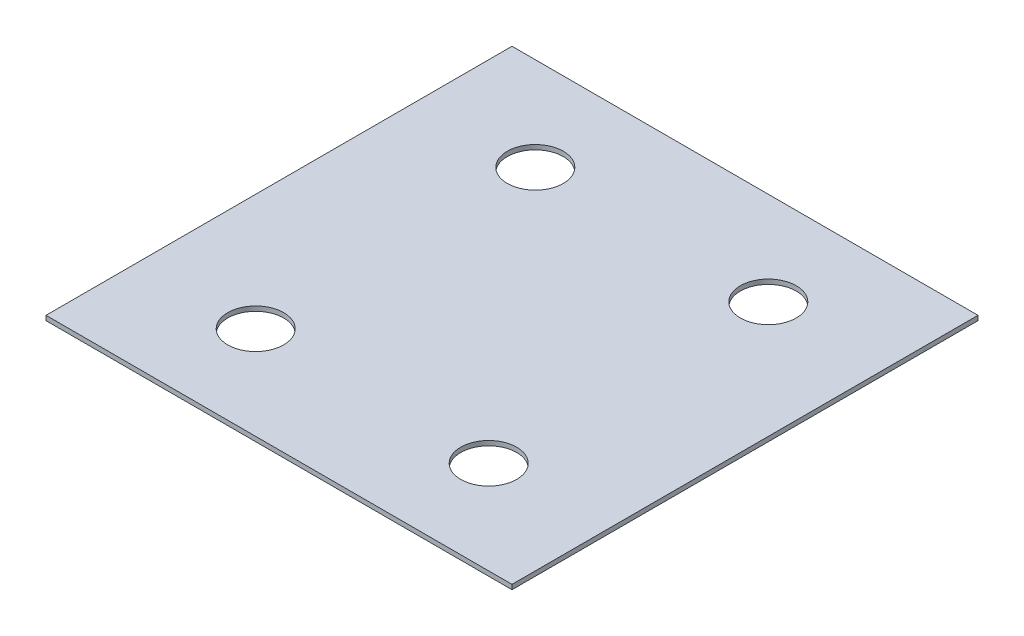
ISO-10303-21;
HEADER;
FILE_DESCRIPTION(('STEP AP214'),'2;1');
FILE_NAME('part.step','',(''),(''),'','','');
FILE_SCHEMA(('AUTOMOTIVE_DESIGN { 1 0 10303 214 1 1 1 1 }'));
ENDSEC;
DATA;
#1=APPLICATION_CONTEXT('core data for automotive mechanical design processes');
#2=APPLICATION_PROTOCOL_DEFINITION('international standard','automotive_design',2000,#1);
#3=PRODUCT_CONTEXT('',#1,'mechanical');
#4=PRODUCT('Part','Part','',(#3));
#5=PRODUCT_RELATED_PRODUCT_CATEGORY('part','',(#4));
#6=PRODUCT_DEFINITION_FORMATION('','',#4);
#7=PRODUCT_DEFINITION_CONTEXT('part definition',#1,'design');
#8=PRODUCT_DEFINITION('design','',#6,#7);
#9=PRODUCT_DEFINITION_SHAPE('','',#8);
#10=(LENGTH_UNIT() NAMED_UNIT(*) SI_UNIT(.MILLI.,.METRE.));
#11=(NAMED_UNIT(*) PLANE_ANGLE_UNIT() SI_UNIT($,.RADIAN.));
#12=(NAMED_UNIT(*) SI_UNIT($,.STERADIAN.) SOLID_ANGLE_UNIT());
#13=UNCERTAINTY_MEASURE_WITH_UNIT(LENGTH_MEASURE(1.E-05),#10,'distance_accuracy_value','');
#14=(GEOMETRIC_REPRESENTATION_CONTEXT(3) GLOBAL_UNCERTAINTY_ASSIGNED_CONTEXT((#13)) GLOBAL_UNIT_ASSIGNED_CONTEXT((#10,
#11,#12)) REPRESENTATION_CONTEXT('',''));
#15=CARTESIAN_POINT('',(0.,0.,0.));
#16=DIRECTION('',(0.,0.,1.));
#17=DIRECTION('',(1.,0.,0.));
#18=AXIS2_PLACEMENT_3D('',#15,#16,#17);
#19=CARTESIAN_POINT('',(250.,5.,250.));
#20=DIRECTION('',(-1.,0.,0.));
#21=DIRECTION('',(0.,0.,1.));
#22=AXIS2_PLACEMENT_3D('',#19,#20,#21);
#23=PLANE('',#22);
#24=DIRECTION('',(0.,0.,-1.));
#25=VECTOR('',#24,1.);
#26=CARTESIAN_POINT('',(250.,0.,250.));
#27=LINE('',#26,#25);
#28=CARTESIAN_POINT('',(250.,0.,250.));
#29=VERTEX_POINT('',#28);
#30=CARTESIAN_POINT('',(250.,0.,-250.));
#31=VERTEX_POINT('',#30);
#32=EDGE_CURVE('E96',#29,#31,#27,.T.);
#33=ORIENTED_EDGE('',*,*,#32,.T.);
#34=DIRECTION('',(0.,-1.,0.));
#35=VECTOR('',#34,1.);
#36=CARTESIAN_POINT('',(250.,5.,-250.));
#37=LINE('',#36,#35);
#38=CARTESIAN_POINT('',(250.,5.,-250.));
#39=VERTEX_POINT('',#38);
#40=EDGE_CURVE('E11',#39,#31,#37,.T.);
#41=ORIENTED_EDGE('',*,*,#40,.F.);
#42=DIRECTION('',(0.,0.,-1.));
#43=VECTOR('',#42,1.);
#44=CARTESIAN_POINT('',(250.,5.,250.));
#45=LINE('',#44,#43);
#46=CARTESIAN_POINT('',(250.,5.,250.));
#47=VERTEX_POINT('',#46);
#48=EDGE_CURVE('E84',#47,#39,#45,.T.);
#49=ORIENTED_EDGE('',*,*,#48,.F.);
#50=DIRECTION('',(0.,-1.,0.));
#51=VECTOR('',#50,1.);
#52=CARTESIAN_POINT('',(250.,5.,250.));
#53=LINE('',#52,#51);
#54=EDGE_CURVE('E92',#47,#29,#53,.T.);
#55=ORIENTED_EDGE('',*,*,#54,.T.);
#56=EDGE_LOOP('',(#33,#41,#49,#55));
#57=FACE_BOUND('',#56,.T.);
#58=ADVANCED_FACE('F33',(#57),#23,.F.);
#59=CARTESIAN_POINT('',(-250.,5.,-250.));
#60=DIRECTION('',(0.,0.,1.));
#61=DIRECTION('',(1.,0.,0.));
#62=AXIS2_PLACEMENT_3D('',#59,#60,#61);
#63=PLANE('',#62);
#64=DIRECTION('',(-1.,0.,0.));
#65=VECTOR('',#64,1.);
#66=CARTESIAN_POINT('',(-250.,0.,-250.));
#67=LINE('',#66,#65);
#68=CARTESIAN_POINT('',(-250.,0.,-250.));
#69=VERTEX_POINT('',#68);
#70=EDGE_CURVE('E88',#31,#69,#67,.T.);
#71=ORIENTED_EDGE('',*,*,#70,.T.);
#72=DIRECTION('',(0.,-1.,0.));
#73=VECTOR('',#72,1.);
#74=CARTESIAN_POINT('',(-250.,5.,-250.));
#75=LINE('',#74,#73);
#76=CARTESIAN_POINT('',(-250.,5.,-250.));
#77=VERTEX_POINT('',#76);
#78=EDGE_CURVE('E41',#77,#69,#75,.T.);
#79=ORIENTED_EDGE('',*,*,#78,.F.);
#80=DIRECTION('',(-1.,0.,0.));
#81=VECTOR('',#80,1.);
#82=CARTESIAN_POINT('',(-250.,5.,-250.));
#83=LINE('',#82,#81);
#84=EDGE_CURVE('E79',#39,#77,#83,.T.);
#85=ORIENTED_EDGE('',*,*,#84,.F.);
#86=ORIENTED_EDGE('',*,*,#40,.T.);
#87=EDGE_LOOP('',(#71,#79,#85,#86));
#88=FACE_BOUND('',#87,.T.);
#89=ADVANCED_FACE('F87',(#88),#63,.F.);
#90=CARTESIAN_POINT('',(-250.,5.,250.));
#91=DIRECTION('',(1.,0.,0.));
#92=DIRECTION('',(0.,0.,-1.));
#93=AXIS2_PLACEMENT_3D('',#90,#91,#92);
#94=PLANE('',#93);
#95=DIRECTION('',(0.,0.,1.));
#96=VECTOR('',#95,1.);
#97=CARTESIAN_POINT('',(-250.,0.,250.));
#98=LINE('',#97,#96);
#99=CARTESIAN_POINT('',(-250.,0.,250.));
#100=VERTEX_POINT('',#99);
#101=EDGE_CURVE('E66',#69,#100,#98,.T.);
#102=ORIENTED_EDGE('',*,*,#101,.T.);
#103=DIRECTION('',(0.,-1.,0.));
#104=VECTOR('',#103,1.);
#105=CARTESIAN_POINT('',(-250.,5.,250.));
#106=LINE('',#105,#104);
#107=CARTESIAN_POINT('',(-250.,5.,250.));
#108=VERTEX_POINT('',#107);
#109=EDGE_CURVE('E89',#108,#100,#106,.T.);
#110=ORIENTED_EDGE('',*,*,#109,.F.);
#111=DIRECTION('',(0.,0.,1.));
#112=VECTOR('',#111,1.);
#113=CARTESIAN_POINT('',(-250.,5.,250.));
#114=LINE('',#113,#112);
#115=EDGE_CURVE('E82',#77,#108,#114,.T.);
#116=ORIENTED_EDGE('',*,*,#115,.F.);
#117=ORIENTED_EDGE('',*,*,#78,.T.);
#118=EDGE_LOOP('',(#102,#110,#116,#117));
#119=FACE_BOUND('',#118,.T.);
#120=ADVANCED_FACE('F90',(#119),#94,.F.);
#121=CARTESIAN_POINT('',(-250.,5.,250.));
#122=DIRECTION('',(0.,0.,-1.));
#123=DIRECTION('',(-1.,0.,0.));
#124=AXIS2_PLACEMENT_3D('',#121,#122,#123);
#125=PLANE('',#124);
#126=DIRECTION('',(1.,0.,0.));
#127=VECTOR('',#126,1.);
#128=CARTESIAN_POINT('',(-250.,0.,250.));
#129=LINE('',#128,#127);
#130=EDGE_CURVE('E72',#100,#29,#129,.T.);
#131=ORIENTED_EDGE('',*,*,#130,.T.);
#132=ORIENTED_EDGE('',*,*,#54,.F.);
#133=DIRECTION('',(1.,0.,0.));
#134=VECTOR('',#133,1.);
#135=CARTESIAN_POINT('',(-250.,5.,250.));
#136=LINE('',#135,#134);
#137=EDGE_CURVE('E49',#108,#47,#136,.T.);
#138=ORIENTED_EDGE('',*,*,#137,.F.);
#139=ORIENTED_EDGE('',*,*,#109,.T.);
#140=EDGE_LOOP('',(#131,#132,#138,#139));
#141=FACE_BOUND('',#140,.T.);
#142=ADVANCED_FACE('F104',(#141),#125,.F.);
#143=CARTESIAN_POINT('',(0.,5.,0.));
#144=DIRECTION('',(0.,-1.,0.));
#145=DIRECTION('',(0.,0.,-1.));
#146=AXIS2_PLACEMENT_3D('',#143,#144,#145);
#147=PLANE('',#146);
#148=CARTESIAN_POINT('',(-125.000000000001,5.,-150.));
#149=DIRECTION('',(0.,1.,0.));
#150=DIRECTION('',(0.,0.,1.));
#151=AXIS2_PLACEMENT_3D('',#148,#149,#150);
#152=CIRCLE('',#151,30.);
#153=CARTESIAN_POINT('',(-125.000000000001,5.,-120.));
#154=VERTEX_POINT('',#153);
#155=EDGE_CURVE('E116',#154,#154,#152,.T.);
#156=ORIENTED_EDGE('',*,*,#155,.F.);
#157=EDGE_LOOP('',(#156));
#158=FACE_BOUND('',#157,.T.);
#159=CARTESIAN_POINT('',(124.999999999999,5.,-150.));
#160=DIRECTION('',(0.,1.,0.));
#161=DIRECTION('',(0.,0.,1.));
#162=AXIS2_PLACEMENT_3D('',#159,#160,#161);
#163=CIRCLE('',#162,30.);
#164=CARTESIAN_POINT('',(124.999999999999,5.,-120.));
#165=VERTEX_POINT('',#164);
#166=EDGE_CURVE('E122',#165,#165,#163,.T.);
#167=ORIENTED_EDGE('',*,*,#166,.F.);
#168=EDGE_LOOP('',(#167));
#169=FACE_BOUND('',#168,.T.);
#170=CARTESIAN_POINT('',(125.,5.,150.));
#171=DIRECTION('',(0.,1.,0.));
#172=DIRECTION('',(0.,0.,1.));
#173=AXIS2_PLACEMENT_3D('',#170,#171,#172);
#174=CIRCLE('',#173,30.);
#175=CARTESIAN_POINT('',(125.,5.,180.));
#176=VERTEX_POINT('',#175);
#177=EDGE_CURVE('E128',#176,#176,#174,.T.);
#178=ORIENTED_EDGE('',*,*,#177,.F.);
#179=EDGE_LOOP('',(#178));
#180=FACE_BOUND('',#179,.T.);
#181=CARTESIAN_POINT('',(-125.,5.,150.));
#182=DIRECTION('',(0.,1.,0.));
#183=DIRECTION('',(0.,0.,1.));
#184=AXIS2_PLACEMENT_3D('',#181,#182,#183);
#185=CIRCLE('',#184,30.);
#186=CARTESIAN_POINT('',(-125.,5.,180.));
#187=VERTEX_POINT('',#186);
#188=EDGE_CURVE('E110',#187,#187,#185,.T.);
#189=ORIENTED_EDGE('',*,*,#188,.F.);
#190=EDGE_LOOP('',(#189));
#191=FACE_BOUND('',#190,.T.);
#192=ORIENTED_EDGE('',*,*,#48,.T.);
#193=ORIENTED_EDGE('',*,*,#84,.T.);
#194=ORIENTED_EDGE('',*,*,#115,.T.);
#195=ORIENTED_EDGE('',*,*,#137,.T.);
#196=EDGE_LOOP('',(#192,#193,#194,#195));
#197=FACE_BOUND('',#196,.T.);
#198=ADVANCED_FACE('F80',(#158,#169,#180,#191,#197),#147,.F.);
#199=CARTESIAN_POINT('',(0.,0.,0.));
#200=DIRECTION('',(0.,-1.,0.));
#201=DIRECTION('',(0.,0.,-1.));
#202=AXIS2_PLACEMENT_3D('',#199,#200,#201);
#203=PLANE('',#202);
#204=CARTESIAN_POINT('',(-125.000000000001,0.,-150.));
#205=DIRECTION('',(0.,1.,0.));
#206=DIRECTION('',(0.,0.,1.));
#207=AXIS2_PLACEMENT_3D('',#204,#205,#206);
#208=CIRCLE('',#207,30.);
#209=CARTESIAN_POINT('',(-125.000000000001,0.,-120.));
#210=VERTEX_POINT('',#209);
#211=EDGE_CURVE('E119',#210,#210,#208,.T.);
#212=ORIENTED_EDGE('',*,*,#211,.T.);
#213=EDGE_LOOP('',(#212));
#214=FACE_BOUND('',#213,.T.);
#215=CARTESIAN_POINT('',(124.999999999999,0.,-150.));
#216=DIRECTION('',(0.,1.,0.));
#217=DIRECTION('',(0.,0.,1.));
#218=AXIS2_PLACEMENT_3D('',#215,#216,#217);
#219=CIRCLE('',#218,30.);
#220=CARTESIAN_POINT('',(124.999999999999,0.,-120.));
#221=VERTEX_POINT('',#220);
#222=EDGE_CURVE('E125',#221,#221,#219,.T.);
#223=ORIENTED_EDGE('',*,*,#222,.T.);
#224=EDGE_LOOP('',(#223));
#225=FACE_BOUND('',#224,.T.);
#226=CARTESIAN_POINT('',(125.,0.,150.));
#227=DIRECTION('',(0.,1.,0.));
#228=DIRECTION('',(0.,0.,1.));
#229=AXIS2_PLACEMENT_3D('',#226,#227,#228);
#230=CIRCLE('',#229,30.);
#231=CARTESIAN_POINT('',(125.,0.,180.));
#232=VERTEX_POINT('',#231);
#233=EDGE_CURVE('E113',#232,#232,#230,.T.);
#234=ORIENTED_EDGE('',*,*,#233,.T.);
#235=EDGE_LOOP('',(#234));
#236=FACE_BOUND('',#235,.T.);
#237=CARTESIAN_POINT('',(-125.,0.,150.));
#238=DIRECTION('',(0.,1.,0.));
#239=DIRECTION('',(0.,0.,1.));
#240=AXIS2_PLACEMENT_3D('',#237,#238,#239);
#241=CIRCLE('',#240,30.);
#242=CARTESIAN_POINT('',(-125.,0.,180.));
#243=VERTEX_POINT('',#242);
#244=EDGE_CURVE('E99',#243,#243,#241,.T.);
#245=ORIENTED_EDGE('',*,*,#244,.T.);
#246=EDGE_LOOP('',(#245));
#247=FACE_BOUND('',#246,.T.);
#248=ORIENTED_EDGE('',*,*,#32,.F.);
#249=ORIENTED_EDGE('',*,*,#130,.F.);
#250=ORIENTED_EDGE('',*,*,#101,.F.);
#251=ORIENTED_EDGE('',*,*,#70,.F.);
#252=EDGE_LOOP('',(#248,#249,#250,#251));
#253=FACE_BOUND('',#252,.T.);
#254=ADVANCED_FACE('F107',(#214,#225,#236,#247,#253),#203,.T.);
#255=CARTESIAN_POINT('',(-125.,0.,150.));
#256=DIRECTION('',(0.,1.,0.));
#257=DIRECTION('',(0.,0.,1.));
#258=AXIS2_PLACEMENT_3D('',#255,#256,#257);
#259=CYLINDRICAL_SURFACE('',#258,30.);
#260=ORIENTED_EDGE('',*,*,#244,.F.);
#261=EDGE_LOOP('',(#260));
#262=FACE_BOUND('',#261,.T.);
#263=ORIENTED_EDGE('',*,*,#188,.T.);
#264=EDGE_LOOP('',(#263));
#265=FACE_BOUND('',#264,.T.);
#266=ADVANCED_FACE('F140',(#262,#265),#259,.F.);
#267=CARTESIAN_POINT('',(125.,0.,150.));
#268=DIRECTION('',(0.,1.,0.));
#269=DIRECTION('',(0.,0.,1.));
#270=AXIS2_PLACEMENT_3D('',#267,#268,#269);
#271=CYLINDRICAL_SURFACE('',#270,30.);
#272=ORIENTED_EDGE('',*,*,#233,.F.);
#273=EDGE_LOOP('',(#272));
#274=FACE_BOUND('',#273,.T.);
#275=ORIENTED_EDGE('',*,*,#177,.T.);
#276=EDGE_LOOP('',(#275));
#277=FACE_BOUND('',#276,.T.);
#278=ADVANCED_FACE('F136',(#274,#277),#271,.F.);
#279=CARTESIAN_POINT('',(124.999999999999,0.,-150.));
#280=DIRECTION('',(0.,1.,0.));
#281=DIRECTION('',(0.,0.,1.));
#282=AXIS2_PLACEMENT_3D('',#279,#280,#281);
#283=CYLINDRICAL_SURFACE('',#282,30.);
#284=ORIENTED_EDGE('',*,*,#222,.F.);
#285=EDGE_LOOP('',(#284));
#286=FACE_BOUND('',#285,.T.);
#287=ORIENTED_EDGE('',*,*,#166,.T.);
#288=EDGE_LOOP('',(#287));
#289=FACE_BOUND('',#288,.T.);
#290=ADVANCED_FACE('F139',(#286,#289),#283,.F.);
#291=CARTESIAN_POINT('',(-125.000000000001,0.,-150.));
#292=DIRECTION('',(0.,1.,0.));
#293=DIRECTION('',(0.,0.,1.));
#294=AXIS2_PLACEMENT_3D('',#291,#292,#293);
#295=CYLINDRICAL_SURFACE('',#294,30.);
#296=ORIENTED_EDGE('',*,*,#211,.F.);
#297=EDGE_LOOP('',(#296));
#298=FACE_BOUND('',#297,.T.);
#299=ORIENTED_EDGE('',*,*,#155,.T.);
#300=EDGE_LOOP('',(#299));
#301=FACE_BOUND('',#300,.T.);
#302=ADVANCED_FACE('F203',(#298,#301),#295,.F.);
#303=CLOSED_SHELL('',(#58,#89,#120,#142,#198,#254,#266,#278,#290,#302));
#304=MANIFOLD_SOLID_BREP('B2',#303);
#305=ADVANCED_BREP_SHAPE_REPRESENTATION('',(#18,#304),#14);
#306=SHAPE_DEFINITION_REPRESENTATION(#9,#305);
ENDSEC;
END-ISO-10303-21;
